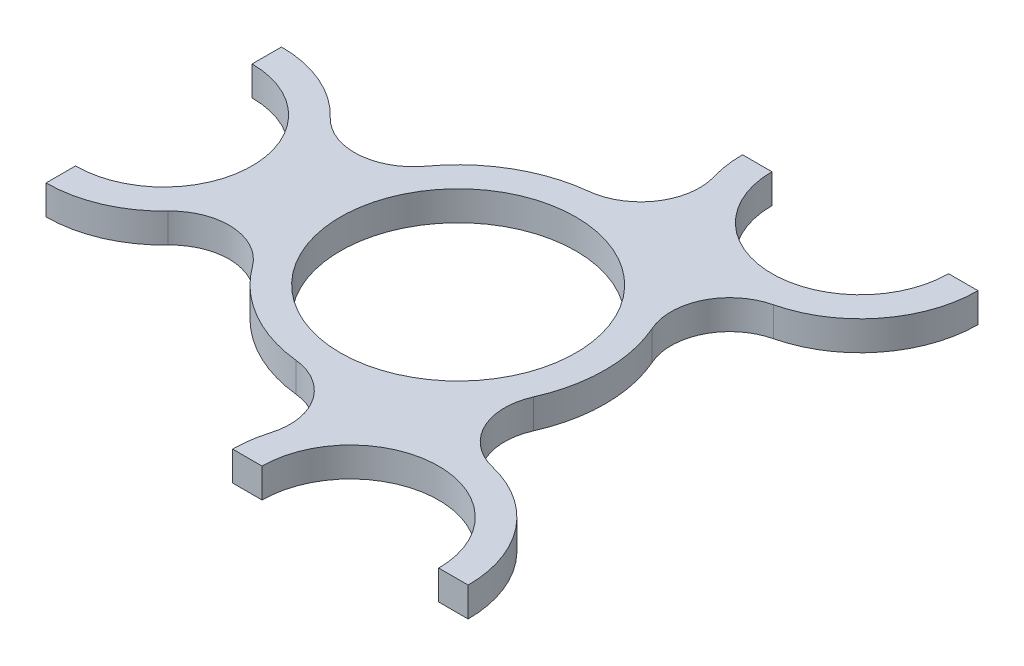
ISO-10303-21;
HEADER;
FILE_DESCRIPTION(('STEP AP214'),'2;1');
FILE_NAME('part.step','',(''),(''),'','','');
FILE_SCHEMA(('AUTOMOTIVE_DESIGN { 1 0 10303 214 1 1 1 1 }'));
ENDSEC;
DATA;
#1=APPLICATION_CONTEXT('core data for automotive mechanical design processes');
#2=APPLICATION_PROTOCOL_DEFINITION('international standard','automotive_design',2000,#1);
#3=PRODUCT_CONTEXT('',#1,'mechanical');
#4=PRODUCT('Part','Part','',(#3));
#5=PRODUCT_RELATED_PRODUCT_CATEGORY('part','',(#4));
#6=PRODUCT_DEFINITION_FORMATION('','',#4);
#7=PRODUCT_DEFINITION_CONTEXT('part definition',#1,'design');
#8=PRODUCT_DEFINITION('design','',#6,#7);
#9=PRODUCT_DEFINITION_SHAPE('','',#8);
#10=(LENGTH_UNIT() NAMED_UNIT(*) SI_UNIT(.MILLI.,.METRE.));
#11=(NAMED_UNIT(*) PLANE_ANGLE_UNIT() SI_UNIT($,.RADIAN.));
#12=(NAMED_UNIT(*) SI_UNIT($,.STERADIAN.) SOLID_ANGLE_UNIT());
#13=UNCERTAINTY_MEASURE_WITH_UNIT(LENGTH_MEASURE(1.E-05),#10,'distance_accuracy_value','');
#14=(GEOMETRIC_REPRESENTATION_CONTEXT(3) GLOBAL_UNCERTAINTY_ASSIGNED_CONTEXT((#13)) GLOBAL_UNIT_ASSIGNED_CONTEXT((#10,
#11,#12)) REPRESENTATION_CONTEXT('',''));
#15=CARTESIAN_POINT('',(0.,0.,0.));
#16=DIRECTION('',(0.,0.,1.));
#17=DIRECTION('',(1.,0.,0.));
#18=AXIS2_PLACEMENT_3D('',#15,#16,#17);
#19=CARTESIAN_POINT('',(-100.,10.,0.));
#20=DIRECTION('',(0.,1.,0.));
#21=DIRECTION('',(0.,0.,1.));
#22=AXIS2_PLACEMENT_3D('',#19,#20,#21);
#23=PLANE('',#22);
#24=CARTESIAN_POINT('',(-100.,10.,0.));
#25=DIRECTION('',(0.,1.,0.));
#26=DIRECTION('',(0.,0.,1.));
#27=AXIS2_PLACEMENT_3D('',#24,#25,#26);
#28=CIRCLE('',#27,40.);
#29=CARTESIAN_POINT('',(-99.9999999999996,10.,40.));
#30=VERTEX_POINT('',#29);
#31=CARTESIAN_POINT('',(-71.,10.,27.5499546279118));
#32=VERTEX_POINT('',#31);
#33=EDGE_CURVE('E273',#30,#32,#28,.T.);
#34=ORIENTED_EDGE('',*,*,#33,.T.);
#35=CARTESIAN_POINT('',(-56.5,10.,41.3249319418677));
#36=DIRECTION('',(0.,-1.,0.));
#37=DIRECTION('',(0.,0.,1.));
#38=AXIS2_PLACEMENT_3D('',#35,#36,#37);
#39=CIRCLE('',#38,20.);
#40=CARTESIAN_POINT('',(-40.3571428571429,10.,29.5178085299055));
#41=VERTEX_POINT('',#40);
#42=EDGE_CURVE('E141',#32,#41,#39,.T.);
#43=ORIENTED_EDGE('',*,*,#42,.T.);
#44=CARTESIAN_POINT('',(0.,10.,0.));
#45=DIRECTION('',(0.,1.,0.));
#46=DIRECTION('',(0.,0.,1.));
#47=AXIS2_PLACEMENT_3D('',#44,#45,#46);
#48=CIRCLE('',#47,50.);
#49=CARTESIAN_POINT('',(-5.38512036041635,10.,49.7091589015931));
#50=VERTEX_POINT('',#49);
#51=EDGE_CURVE('E336',#41,#50,#48,.T.);
#52=ORIENTED_EDGE('',*,*,#51,.T.);
#53=CARTESIAN_POINT('',(-7.53916850458289,10.,69.5928224622303));
#54=DIRECTION('',(0.,-1.,0.));
#55=DIRECTION('',(0.,0.,1.));
#56=AXIS2_PLACEMENT_3D('',#53,#54,#55);
#57=CIRCLE('',#56,20.);
#58=CARTESIAN_POINT('',(11.6405543302781,10.,75.2618816414869));
#59=VERTEX_POINT('',#58);
#60=EDGE_CURVE('E355',#50,#59,#57,.T.);
#61=ORIENTED_EDGE('',*,*,#60,.T.);
#62=CARTESIAN_POINT('',(50.,10.,86.6));
#63=DIRECTION('',(0.,1.,0.));
#64=DIRECTION('',(0.,0.,-1.));
#65=AXIS2_PLACEMENT_3D('',#62,#63,#64);
#66=CIRCLE('',#65,40.);
#67=CARTESIAN_POINT('',(9.99999999999999,10.,86.5999999999997));
#68=VERTEX_POINT('',#67);
#69=EDGE_CURVE('E352',#59,#68,#66,.T.);
#70=ORIENTED_EDGE('',*,*,#69,.T.);
#71=DIRECTION('',(1.,0.,0.));
#72=VECTOR('',#71,1.);
#73=CARTESIAN_POINT('',(9.99999999999999,10.,86.5999999999997));
#74=LINE('',#73,#72);
#75=CARTESIAN_POINT('',(20.,10.,86.5999999999998));
#76=VERTEX_POINT('',#75);
#77=EDGE_CURVE('E354',#68,#76,#74,.T.);
#78=ORIENTED_EDGE('',*,*,#77,.T.);
#79=CARTESIAN_POINT('',(50.,10.,86.6));
#80=DIRECTION('',(0.,-1.,0.));
#81=DIRECTION('',(0.,0.,-1.));
#82=AXIS2_PLACEMENT_3D('',#79,#80,#81);
#83=CIRCLE('',#82,30.);
#84=CARTESIAN_POINT('',(80.,10.,86.5999999999999));
#85=VERTEX_POINT('',#84);
#86=EDGE_CURVE('E357',#76,#85,#83,.T.);
#87=ORIENTED_EDGE('',*,*,#86,.T.);
#88=DIRECTION('',(1.,0.,0.));
#89=VECTOR('',#88,1.);
#90=CARTESIAN_POINT('',(80.,10.,86.5999999999999));
#91=LINE('',#90,#89);
#92=CARTESIAN_POINT('',(90.,10.,86.6));
#93=VERTEX_POINT('',#92);
#94=EDGE_CURVE('E363',#85,#93,#91,.T.);
#95=ORIENTED_EDGE('',*,*,#94,.T.);
#96=CARTESIAN_POINT('',(50.,10.,86.6));
#97=DIRECTION('',(0.,1.,0.));
#98=DIRECTION('',(0.,0.,-1.));
#99=AXIS2_PLACEMENT_3D('',#96,#97,#98);
#100=CIRCLE('',#99,40.);
#101=CARTESIAN_POINT('',(59.3596363447783,10.,47.7104486077107));
#102=VERTEX_POINT('',#101);
#103=EDGE_CURVE('E365',#93,#102,#100,.T.);
#104=ORIENTED_EDGE('',*,*,#103,.T.);
#105=CARTESIAN_POINT('',(64.0394545171674,10.,28.2656729115661));
#106=DIRECTION('',(0.,-1.,0.));
#107=DIRECTION('',(0.,0.,1.));
#108=AXIS2_PLACEMENT_3D('',#105,#106,#107);
#109=CIRCLE('',#108,20.);
#110=CARTESIAN_POINT('',(45.7424675122625,10.,20.1897663654044));
#111=VERTEX_POINT('',#110);
#112=EDGE_CURVE('E367',#102,#111,#109,.T.);
#113=ORIENTED_EDGE('',*,*,#112,.T.);
#114=CARTESIAN_POINT('',(0.,10.,0.));
#115=DIRECTION('',(0.,1.,0.));
#116=DIRECTION('',(0.,0.,1.));
#117=AXIS2_PLACEMENT_3D('',#114,#115,#116);
#118=CIRCLE('',#117,50.);
#119=CARTESIAN_POINT('',(45.7424675122625,10.,-20.1897663654044));
#120=VERTEX_POINT('',#119);
#121=EDGE_CURVE('E369',#111,#120,#118,.T.);
#122=ORIENTED_EDGE('',*,*,#121,.T.);
#123=CARTESIAN_POINT('',(64.0394545171674,10.,-28.2656729115661));
#124=DIRECTION('',(0.,-1.,0.));
#125=DIRECTION('',(0.,0.,1.));
#126=AXIS2_PLACEMENT_3D('',#123,#124,#125);
#127=CIRCLE('',#126,20.);
#128=CARTESIAN_POINT('',(59.3596363447783,10.,-47.7104486077107));
#129=VERTEX_POINT('',#128);
#130=EDGE_CURVE('E371',#120,#129,#127,.T.);
#131=ORIENTED_EDGE('',*,*,#130,.T.);
#132=CARTESIAN_POINT('',(50.,10.,-86.6));
#133=DIRECTION('',(0.,1.,0.));
#134=DIRECTION('',(0.,0.,1.));
#135=AXIS2_PLACEMENT_3D('',#132,#133,#134);
#136=CIRCLE('',#135,40.);
#137=CARTESIAN_POINT('',(90.,10.,-86.6));
#138=VERTEX_POINT('',#137);
#139=EDGE_CURVE('E373',#129,#138,#136,.T.);
#140=ORIENTED_EDGE('',*,*,#139,.T.);
#141=DIRECTION('',(-1.,0.,0.));
#142=VECTOR('',#141,1.);
#143=CARTESIAN_POINT('',(80.,10.,-86.5999999999999));
#144=LINE('',#143,#142);
#145=CARTESIAN_POINT('',(80.,10.,-86.5999999999999));
#146=VERTEX_POINT('',#145);
#147=EDGE_CURVE('E375',#138,#146,#144,.T.);
#148=ORIENTED_EDGE('',*,*,#147,.T.);
#149=CARTESIAN_POINT('',(50.,10.,-86.6));
#150=DIRECTION('',(0.,-1.,0.));
#151=DIRECTION('',(0.,0.,1.));
#152=AXIS2_PLACEMENT_3D('',#149,#150,#151);
#153=CIRCLE('',#152,30.);
#154=CARTESIAN_POINT('',(20.,10.,-86.5999999999998));
#155=VERTEX_POINT('',#154);
#156=EDGE_CURVE('E377',#146,#155,#153,.T.);
#157=ORIENTED_EDGE('',*,*,#156,.T.);
#158=DIRECTION('',(-1.,0.,0.));
#159=VECTOR('',#158,1.);
#160=CARTESIAN_POINT('',(9.99999999999998,10.,-86.5999999999997));
#161=LINE('',#160,#159);
#162=CARTESIAN_POINT('',(9.99999999999998,10.,-86.5999999999997));
#163=VERTEX_POINT('',#162);
#164=EDGE_CURVE('E379',#155,#163,#161,.T.);
#165=ORIENTED_EDGE('',*,*,#164,.T.);
#166=CARTESIAN_POINT('',(50.,10.,-86.6));
#167=DIRECTION('',(0.,1.,0.));
#168=DIRECTION('',(0.,0.,1.));
#169=AXIS2_PLACEMENT_3D('',#166,#167,#168);
#170=CIRCLE('',#169,40.);
#171=CARTESIAN_POINT('',(11.6405543302781,10.,-75.2618816414869));
#172=VERTEX_POINT('',#171);
#173=EDGE_CURVE('E381',#163,#172,#170,.T.);
#174=ORIENTED_EDGE('',*,*,#173,.T.);
#175=CARTESIAN_POINT('',(-7.53916850458291,10.,-69.5928224622303));
#176=DIRECTION('',(0.,-1.,0.));
#177=DIRECTION('',(0.,0.,1.));
#178=AXIS2_PLACEMENT_3D('',#175,#176,#177);
#179=CIRCLE('',#178,20.);
#180=CARTESIAN_POINT('',(-5.38512036041635,10.,-49.7091589015931));
#181=VERTEX_POINT('',#180);
#182=EDGE_CURVE('E383',#172,#181,#179,.T.);
#183=ORIENTED_EDGE('',*,*,#182,.T.);
#184=CARTESIAN_POINT('',(0.,10.,0.));
#185=DIRECTION('',(0.,1.,0.));
#186=DIRECTION('',(0.,0.,1.));
#187=AXIS2_PLACEMENT_3D('',#184,#185,#186);
#188=CIRCLE('',#187,50.);
#189=CARTESIAN_POINT('',(-40.3571428571429,10.,-29.5178085299055));
#190=VERTEX_POINT('',#189);
#191=EDGE_CURVE('E385',#181,#190,#188,.T.);
#192=ORIENTED_EDGE('',*,*,#191,.T.);
#193=CARTESIAN_POINT('',(-56.5,10.,-41.3249319418677));
#194=DIRECTION('',(0.,-1.,0.));
#195=DIRECTION('',(0.,0.,1.));
#196=AXIS2_PLACEMENT_3D('',#193,#194,#195);
#197=CIRCLE('',#196,20.);
#198=CARTESIAN_POINT('',(-71.,10.,-27.5499546279118));
#199=VERTEX_POINT('',#198);
#200=EDGE_CURVE('E387',#190,#199,#197,.T.);
#201=ORIENTED_EDGE('',*,*,#200,.T.);
#202=CARTESIAN_POINT('',(-100.,10.,0.));
#203=DIRECTION('',(0.,1.,0.));
#204=DIRECTION('',(0.,0.,1.));
#205=AXIS2_PLACEMENT_3D('',#202,#203,#204);
#206=CIRCLE('',#205,40.);
#207=CARTESIAN_POINT('',(-100.,10.,-40.));
#208=VERTEX_POINT('',#207);
#209=EDGE_CURVE('E208',#199,#208,#206,.T.);
#210=ORIENTED_EDGE('',*,*,#209,.T.);
#211=DIRECTION('',(0.,0.,1.));
#212=VECTOR('',#211,1.);
#213=CARTESIAN_POINT('',(-100.,10.,-30.));
#214=LINE('',#213,#212);
#215=CARTESIAN_POINT('',(-100.,10.,-30.));
#216=VERTEX_POINT('',#215);
#217=EDGE_CURVE('E202',#208,#216,#214,.T.);
#218=ORIENTED_EDGE('',*,*,#217,.T.);
#219=CARTESIAN_POINT('',(-100.,10.,0.));
#220=DIRECTION('',(0.,-1.,0.));
#221=DIRECTION('',(0.,0.,1.));
#222=AXIS2_PLACEMENT_3D('',#219,#220,#221);
#223=CIRCLE('',#222,30.);
#224=CARTESIAN_POINT('',(-99.9999999999997,10.,30.));
#225=VERTEX_POINT('',#224);
#226=EDGE_CURVE('E206',#216,#225,#223,.T.);
#227=ORIENTED_EDGE('',*,*,#226,.T.);
#228=DIRECTION('',(0.,0.,1.));
#229=VECTOR('',#228,1.);
#230=CARTESIAN_POINT('',(-99.9999999999996,10.,40.));
#231=LINE('',#230,#229);
#232=EDGE_CURVE('E50',#225,#30,#231,.T.);
#233=ORIENTED_EDGE('',*,*,#232,.T.);
#234=EDGE_LOOP('',(#34,#43,#52,#61,#70,#78,#87,#95,#104,#113,#122,#131,#140,#148,#157,#165,#174,
#183,#192,#201,#210,#218,#227,#233));
#235=FACE_BOUND('',#234,.T.);
#236=CARTESIAN_POINT('',(0.,10.,0.));
#237=DIRECTION('',(0.,1.,0.));
#238=DIRECTION('',(0.,0.,1.));
#239=AXIS2_PLACEMENT_3D('',#236,#237,#238);
#240=CIRCLE('',#239,40.);
#241=CARTESIAN_POINT('',(0.,10.,40.));
#242=VERTEX_POINT('',#241);
#243=EDGE_CURVE('E230',#242,#242,#240,.T.);
#244=ORIENTED_EDGE('',*,*,#243,.F.);
#245=EDGE_LOOP('',(#244));
#246=FACE_BOUND('',#245,.T.);
#247=ADVANCED_FACE('F33',(#235,#246),#23,.T.);
#248=CARTESIAN_POINT('',(-100.,0.,0.));
#249=DIRECTION('',(0.,1.,0.));
#250=DIRECTION('',(0.,0.,1.));
#251=AXIS2_PLACEMENT_3D('',#248,#249,#250);
#252=PLANE('',#251);
#253=CARTESIAN_POINT('',(-100.,0.,0.));
#254=DIRECTION('',(0.,1.,0.));
#255=DIRECTION('',(0.,0.,1.));
#256=AXIS2_PLACEMENT_3D('',#253,#254,#255);
#257=CIRCLE('',#256,40.);
#258=CARTESIAN_POINT('',(-99.9999999999996,0.,40.));
#259=VERTEX_POINT('',#258);
#260=CARTESIAN_POINT('',(-71.,0.,27.5499546279118));
#261=VERTEX_POINT('',#260);
#262=EDGE_CURVE('E226',#259,#261,#257,.T.);
#263=ORIENTED_EDGE('',*,*,#262,.F.);
#264=DIRECTION('',(0.,0.,1.));
#265=VECTOR('',#264,1.);
#266=CARTESIAN_POINT('',(-99.9999999999996,0.,40.));
#267=LINE('',#266,#265);
#268=CARTESIAN_POINT('',(-99.9999999999997,0.,30.));
#269=VERTEX_POINT('',#268);
#270=EDGE_CURVE('E133',#269,#259,#267,.T.);
#271=ORIENTED_EDGE('',*,*,#270,.F.);
#272=CARTESIAN_POINT('',(-100.,0.,0.));
#273=DIRECTION('',(0.,-1.,0.));
#274=DIRECTION('',(0.,0.,1.));
#275=AXIS2_PLACEMENT_3D('',#272,#273,#274);
#276=CIRCLE('',#275,30.);
#277=CARTESIAN_POINT('',(-100.,0.,-30.));
#278=VERTEX_POINT('',#277);
#279=EDGE_CURVE('E127',#278,#269,#276,.T.);
#280=ORIENTED_EDGE('',*,*,#279,.F.);
#281=DIRECTION('',(0.,0.,1.));
#282=VECTOR('',#281,1.);
#283=CARTESIAN_POINT('',(-100.,0.,-30.));
#284=LINE('',#283,#282);
#285=CARTESIAN_POINT('',(-100.,0.,-40.));
#286=VERTEX_POINT('',#285);
#287=EDGE_CURVE('E216',#286,#278,#284,.T.);
#288=ORIENTED_EDGE('',*,*,#287,.F.);
#289=CARTESIAN_POINT('',(-100.,0.,0.));
#290=DIRECTION('',(0.,1.,0.));
#291=DIRECTION('',(0.,0.,1.));
#292=AXIS2_PLACEMENT_3D('',#289,#290,#291);
#293=CIRCLE('',#292,40.);
#294=CARTESIAN_POINT('',(-71.,0.,-27.5499546279118));
#295=VERTEX_POINT('',#294);
#296=EDGE_CURVE('E268',#295,#286,#293,.T.);
#297=ORIENTED_EDGE('',*,*,#296,.F.);
#298=CARTESIAN_POINT('',(-56.5,0.,-41.3249319418677));
#299=DIRECTION('',(0.,-1.,0.));
#300=DIRECTION('',(0.,0.,1.));
#301=AXIS2_PLACEMENT_3D('',#298,#299,#300);
#302=CIRCLE('',#301,20.);
#303=CARTESIAN_POINT('',(-40.3571428571429,0.,-29.5178085299055));
#304=VERTEX_POINT('',#303);
#305=EDGE_CURVE('E266',#304,#295,#302,.T.);
#306=ORIENTED_EDGE('',*,*,#305,.F.);
#307=CARTESIAN_POINT('',(0.,0.,0.));
#308=DIRECTION('',(0.,1.,0.));
#309=DIRECTION('',(0.,0.,1.));
#310=AXIS2_PLACEMENT_3D('',#307,#308,#309);
#311=CIRCLE('',#310,50.);
#312=CARTESIAN_POINT('',(-5.38512036041635,0.,-49.7091589015931));
#313=VERTEX_POINT('',#312);
#314=EDGE_CURVE('E264',#313,#304,#311,.T.);
#315=ORIENTED_EDGE('',*,*,#314,.F.);
#316=CARTESIAN_POINT('',(-7.53916850458291,0.,-69.5928224622303));
#317=DIRECTION('',(0.,-1.,0.));
#318=DIRECTION('',(0.,0.,1.));
#319=AXIS2_PLACEMENT_3D('',#316,#317,#318);
#320=CIRCLE('',#319,20.);
#321=CARTESIAN_POINT('',(11.6405543302781,0.,-75.2618816414869));
#322=VERTEX_POINT('',#321);
#323=EDGE_CURVE('E262',#322,#313,#320,.T.);
#324=ORIENTED_EDGE('',*,*,#323,.F.);
#325=CARTESIAN_POINT('',(50.,0.,-86.6));
#326=DIRECTION('',(0.,1.,0.));
#327=DIRECTION('',(0.,0.,1.));
#328=AXIS2_PLACEMENT_3D('',#325,#326,#327);
#329=CIRCLE('',#328,40.);
#330=CARTESIAN_POINT('',(9.99999999999998,0.,-86.5999999999997));
#331=VERTEX_POINT('',#330);
#332=EDGE_CURVE('E260',#331,#322,#329,.T.);
#333=ORIENTED_EDGE('',*,*,#332,.F.);
#334=DIRECTION('',(-1.,0.,0.));
#335=VECTOR('',#334,1.);
#336=CARTESIAN_POINT('',(9.99999999999998,0.,-86.5999999999997));
#337=LINE('',#336,#335);
#338=CARTESIAN_POINT('',(20.,0.,-86.5999999999998));
#339=VERTEX_POINT('',#338);
#340=EDGE_CURVE('E258',#339,#331,#337,.T.);
#341=ORIENTED_EDGE('',*,*,#340,.F.);
#342=CARTESIAN_POINT('',(50.,0.,-86.6));
#343=DIRECTION('',(0.,-1.,0.));
#344=DIRECTION('',(0.,0.,1.));
#345=AXIS2_PLACEMENT_3D('',#342,#343,#344);
#346=CIRCLE('',#345,30.);
#347=CARTESIAN_POINT('',(80.,0.,-86.5999999999999));
#348=VERTEX_POINT('',#347);
#349=EDGE_CURVE('E256',#348,#339,#346,.T.);
#350=ORIENTED_EDGE('',*,*,#349,.F.);
#351=DIRECTION('',(-1.,0.,0.));
#352=VECTOR('',#351,1.);
#353=CARTESIAN_POINT('',(80.,0.,-86.5999999999999));
#354=LINE('',#353,#352);
#355=CARTESIAN_POINT('',(90.,0.,-86.6));
#356=VERTEX_POINT('',#355);
#357=EDGE_CURVE('E254',#356,#348,#354,.T.);
#358=ORIENTED_EDGE('',*,*,#357,.F.);
#359=CARTESIAN_POINT('',(50.,0.,-86.6));
#360=DIRECTION('',(0.,1.,0.));
#361=DIRECTION('',(0.,0.,1.));
#362=AXIS2_PLACEMENT_3D('',#359,#360,#361);
#363=CIRCLE('',#362,40.);
#364=CARTESIAN_POINT('',(59.3596363447783,0.,-47.7104486077107));
#365=VERTEX_POINT('',#364);
#366=EDGE_CURVE('E252',#365,#356,#363,.T.);
#367=ORIENTED_EDGE('',*,*,#366,.F.);
#368=CARTESIAN_POINT('',(64.0394545171674,0.,-28.2656729115661));
#369=DIRECTION('',(0.,-1.,0.));
#370=DIRECTION('',(0.,0.,1.));
#371=AXIS2_PLACEMENT_3D('',#368,#369,#370);
#372=CIRCLE('',#371,20.);
#373=CARTESIAN_POINT('',(45.7424675122625,0.,-20.1897663654044));
#374=VERTEX_POINT('',#373);
#375=EDGE_CURVE('E250',#374,#365,#372,.T.);
#376=ORIENTED_EDGE('',*,*,#375,.F.);
#377=CARTESIAN_POINT('',(0.,0.,0.));
#378=DIRECTION('',(0.,1.,0.));
#379=DIRECTION('',(0.,0.,1.));
#380=AXIS2_PLACEMENT_3D('',#377,#378,#379);
#381=CIRCLE('',#380,50.);
#382=CARTESIAN_POINT('',(45.7424675122625,0.,20.1897663654044));
#383=VERTEX_POINT('',#382);
#384=EDGE_CURVE('E248',#383,#374,#381,.T.);
#385=ORIENTED_EDGE('',*,*,#384,.F.);
#386=CARTESIAN_POINT('',(64.0394545171674,0.,28.2656729115661));
#387=DIRECTION('',(0.,-1.,0.));
#388=DIRECTION('',(0.,0.,1.));
#389=AXIS2_PLACEMENT_3D('',#386,#387,#388);
#390=CIRCLE('',#389,20.);
#391=CARTESIAN_POINT('',(59.3596363447783,0.,47.7104486077107));
#392=VERTEX_POINT('',#391);
#393=EDGE_CURVE('E246',#392,#383,#390,.T.);
#394=ORIENTED_EDGE('',*,*,#393,.F.);
#395=CARTESIAN_POINT('',(50.,0.,86.6));
#396=DIRECTION('',(0.,1.,0.));
#397=DIRECTION('',(0.,0.,-1.));
#398=AXIS2_PLACEMENT_3D('',#395,#396,#397);
#399=CIRCLE('',#398,40.);
#400=CARTESIAN_POINT('',(90.,0.,86.6));
#401=VERTEX_POINT('',#400);
#402=EDGE_CURVE('E244',#401,#392,#399,.T.);
#403=ORIENTED_EDGE('',*,*,#402,.F.);
#404=DIRECTION('',(1.,0.,0.));
#405=VECTOR('',#404,1.);
#406=CARTESIAN_POINT('',(80.,0.,86.5999999999999));
#407=LINE('',#406,#405);
#408=CARTESIAN_POINT('',(80.,0.,86.5999999999999));
#409=VERTEX_POINT('',#408);
#410=EDGE_CURVE('E242',#409,#401,#407,.T.);
#411=ORIENTED_EDGE('',*,*,#410,.F.);
#412=CARTESIAN_POINT('',(50.,0.,86.6));
#413=DIRECTION('',(0.,-1.,0.));
#414=DIRECTION('',(0.,0.,-1.));
#415=AXIS2_PLACEMENT_3D('',#412,#413,#414);
#416=CIRCLE('',#415,30.);
#417=CARTESIAN_POINT('',(20.,0.,86.5999999999998));
#418=VERTEX_POINT('',#417);
#419=EDGE_CURVE('E240',#418,#409,#416,.T.);
#420=ORIENTED_EDGE('',*,*,#419,.F.);
#421=DIRECTION('',(1.,0.,0.));
#422=VECTOR('',#421,1.);
#423=CARTESIAN_POINT('',(9.99999999999999,0.,86.5999999999997));
#424=LINE('',#423,#422);
#425=CARTESIAN_POINT('',(9.99999999999999,0.,86.5999999999997));
#426=VERTEX_POINT('',#425);
#427=EDGE_CURVE('E238',#426,#418,#424,.T.);
#428=ORIENTED_EDGE('',*,*,#427,.F.);
#429=CARTESIAN_POINT('',(50.,0.,86.6));
#430=DIRECTION('',(0.,1.,0.));
#431=DIRECTION('',(0.,0.,-1.));
#432=AXIS2_PLACEMENT_3D('',#429,#430,#431);
#433=CIRCLE('',#432,40.);
#434=CARTESIAN_POINT('',(11.6405543302781,0.,75.2618816414869));
#435=VERTEX_POINT('',#434);
#436=EDGE_CURVE('E236',#435,#426,#433,.T.);
#437=ORIENTED_EDGE('',*,*,#436,.F.);
#438=CARTESIAN_POINT('',(-7.53916850458289,0.,69.5928224622303));
#439=DIRECTION('',(0.,-1.,0.));
#440=DIRECTION('',(0.,0.,1.));
#441=AXIS2_PLACEMENT_3D('',#438,#439,#440);
#442=CIRCLE('',#441,20.);
#443=CARTESIAN_POINT('',(-5.38512036041635,0.,49.7091589015931));
#444=VERTEX_POINT('',#443);
#445=EDGE_CURVE('E234',#444,#435,#442,.T.);
#446=ORIENTED_EDGE('',*,*,#445,.F.);
#447=CARTESIAN_POINT('',(0.,0.,0.));
#448=DIRECTION('',(0.,1.,0.));
#449=DIRECTION('',(0.,0.,1.));
#450=AXIS2_PLACEMENT_3D('',#447,#448,#449);
#451=CIRCLE('',#450,50.);
#452=CARTESIAN_POINT('',(-40.3571428571429,0.,29.5178085299055));
#453=VERTEX_POINT('',#452);
#454=EDGE_CURVE('E232',#453,#444,#451,.T.);
#455=ORIENTED_EDGE('',*,*,#454,.F.);
#456=CARTESIAN_POINT('',(-56.5,0.,41.3249319418677));
#457=DIRECTION('',(0.,-1.,0.));
#458=DIRECTION('',(0.,0.,1.));
#459=AXIS2_PLACEMENT_3D('',#456,#457,#458);
#460=CIRCLE('',#459,20.);
#461=EDGE_CURVE('E229',#261,#453,#460,.T.);
#462=ORIENTED_EDGE('',*,*,#461,.F.);
#463=EDGE_LOOP('',(#263,#271,#280,#288,#297,#306,#315,#324,#333,#341,#350,#358,#367,#376,#385,
#394,#403,#411,#420,#428,#437,#446,#455,#462));
#464=FACE_BOUND('',#463,.T.);
#465=CARTESIAN_POINT('',(0.,0.,0.));
#466=DIRECTION('',(0.,1.,0.));
#467=DIRECTION('',(0.,0.,1.));
#468=AXIS2_PLACEMENT_3D('',#465,#466,#467);
#469=CIRCLE('',#468,40.);
#470=CARTESIAN_POINT('',(0.,0.,40.));
#471=VERTEX_POINT('',#470);
#472=EDGE_CURVE('E690',#471,#471,#469,.T.);
#473=ORIENTED_EDGE('',*,*,#472,.T.);
#474=EDGE_LOOP('',(#473));
#475=FACE_BOUND('',#474,.T.);
#476=ADVANCED_FACE('F340',(#464,#475),#252,.F.);
#477=CARTESIAN_POINT('',(-100.,10.,0.));
#478=DIRECTION('',(0.,-1.,0.));
#479=DIRECTION('',(0.,0.,-1.));
#480=AXIS2_PLACEMENT_3D('',#477,#478,#479);
#481=CYLINDRICAL_SURFACE('',#480,40.);
#482=ORIENTED_EDGE('',*,*,#262,.T.);
#483=DIRECTION('',(0.,-1.,0.));
#484=VECTOR('',#483,1.);
#485=CARTESIAN_POINT('',(-71.,10.,27.5499546279118));
#486=LINE('',#485,#484);
#487=EDGE_CURVE('E11',#32,#261,#486,.T.);
#488=ORIENTED_EDGE('',*,*,#487,.F.);
#489=ORIENTED_EDGE('',*,*,#33,.F.);
#490=DIRECTION('',(0.,-1.,0.));
#491=VECTOR('',#490,1.);
#492=CARTESIAN_POINT('',(-99.9999999999996,10.,40.));
#493=LINE('',#492,#491);
#494=EDGE_CURVE('E222',#30,#259,#493,.T.);
#495=ORIENTED_EDGE('',*,*,#494,.T.);
#496=EDGE_LOOP('',(#482,#488,#489,#495));
#497=FACE_BOUND('',#496,.T.);
#498=ADVANCED_FACE('F35',(#497),#481,.T.);
#499=CARTESIAN_POINT('',(-56.5,10.,41.3249319418677));
#500=DIRECTION('',(0.,-1.,0.));
#501=DIRECTION('',(0.,0.,-1.));
#502=AXIS2_PLACEMENT_3D('',#499,#500,#501);
#503=CYLINDRICAL_SURFACE('',#502,20.);
#504=ORIENTED_EDGE('',*,*,#461,.T.);
#505=DIRECTION('',(0.,-1.,0.));
#506=VECTOR('',#505,1.);
#507=CARTESIAN_POINT('',(-40.3571428571429,10.,29.5178085299055));
#508=LINE('',#507,#506);
#509=EDGE_CURVE('E42',#41,#453,#508,.T.);
#510=ORIENTED_EDGE('',*,*,#509,.F.);
#511=ORIENTED_EDGE('',*,*,#42,.F.);
#512=ORIENTED_EDGE('',*,*,#487,.T.);
#513=EDGE_LOOP('',(#504,#510,#511,#512));
#514=FACE_BOUND('',#513,.T.);
#515=ADVANCED_FACE('F421',(#514),#503,.F.);
#516=CARTESIAN_POINT('',(0.,10.,0.));
#517=DIRECTION('',(0.,-1.,0.));
#518=DIRECTION('',(0.,0.,-1.));
#519=AXIS2_PLACEMENT_3D('',#516,#517,#518);
#520=CYLINDRICAL_SURFACE('',#519,50.);
#521=ORIENTED_EDGE('',*,*,#454,.T.);
#522=DIRECTION('',(0.,-1.,0.));
#523=VECTOR('',#522,1.);
#524=CARTESIAN_POINT('',(-5.38512036041635,10.,49.7091589015931));
#525=LINE('',#524,#523);
#526=EDGE_CURVE('E328',#50,#444,#525,.T.);
#527=ORIENTED_EDGE('',*,*,#526,.F.);
#528=ORIENTED_EDGE('',*,*,#51,.F.);
#529=ORIENTED_EDGE('',*,*,#509,.T.);
#530=EDGE_LOOP('',(#521,#527,#528,#529));
#531=FACE_BOUND('',#530,.T.);
#532=ADVANCED_FACE('F334',(#531),#520,.T.);
#533=CARTESIAN_POINT('',(-7.53916850458289,10.,69.5928224622303));
#534=DIRECTION('',(0.,-1.,0.));
#535=DIRECTION('',(0.,0.,-1.));
#536=AXIS2_PLACEMENT_3D('',#533,#534,#535);
#537=CYLINDRICAL_SURFACE('',#536,20.);
#538=ORIENTED_EDGE('',*,*,#445,.T.);
#539=DIRECTION('',(0.,-1.,0.));
#540=VECTOR('',#539,1.);
#541=CARTESIAN_POINT('',(11.6405543302781,10.,75.2618816414869));
#542=LINE('',#541,#540);
#543=EDGE_CURVE('E325',#59,#435,#542,.T.);
#544=ORIENTED_EDGE('',*,*,#543,.F.);
#545=ORIENTED_EDGE('',*,*,#60,.F.);
#546=ORIENTED_EDGE('',*,*,#526,.T.);
#547=EDGE_LOOP('',(#538,#544,#545,#546));
#548=FACE_BOUND('',#547,.T.);
#549=ADVANCED_FACE('F346',(#548),#537,.F.);
#550=CARTESIAN_POINT('',(50.,10.,86.6));
#551=DIRECTION('',(0.,-1.,0.));
#552=DIRECTION('',(0.,0.,-1.));
#553=AXIS2_PLACEMENT_3D('',#550,#551,#552);
#554=CYLINDRICAL_SURFACE('',#553,40.);
#555=ORIENTED_EDGE('',*,*,#436,.T.);
#556=DIRECTION('',(0.,-1.,0.));
#557=VECTOR('',#556,1.);
#558=CARTESIAN_POINT('',(9.99999999999999,10.,86.5999999999997));
#559=LINE('',#558,#557);
#560=EDGE_CURVE('E322',#68,#426,#559,.T.);
#561=ORIENTED_EDGE('',*,*,#560,.F.);
#562=ORIENTED_EDGE('',*,*,#69,.F.);
#563=ORIENTED_EDGE('',*,*,#543,.T.);
#564=EDGE_LOOP('',(#555,#561,#562,#563));
#565=FACE_BOUND('',#564,.T.);
#566=ADVANCED_FACE('F350',(#565),#554,.T.);
#567=CARTESIAN_POINT('',(9.99999999999999,10.,86.5999999999997));
#568=DIRECTION('',(0.,0.,-1.));
#569=DIRECTION('',(-1.,0.,0.));
#570=AXIS2_PLACEMENT_3D('',#567,#568,#569);
#571=PLANE('',#570);
#572=ORIENTED_EDGE('',*,*,#427,.T.);
#573=DIRECTION('',(0.,-1.,0.));
#574=VECTOR('',#573,1.);
#575=CARTESIAN_POINT('',(20.,10.,86.5999999999998));
#576=LINE('',#575,#574);
#577=EDGE_CURVE('E319',#76,#418,#576,.T.);
#578=ORIENTED_EDGE('',*,*,#577,.F.);
#579=ORIENTED_EDGE('',*,*,#77,.F.);
#580=ORIENTED_EDGE('',*,*,#560,.T.);
#581=EDGE_LOOP('',(#572,#578,#579,#580));
#582=FACE_BOUND('',#581,.T.);
#583=ADVANCED_FACE('F434',(#582),#571,.F.);
#584=CARTESIAN_POINT('',(50.,10.,86.6));
#585=DIRECTION('',(0.,-1.,0.));
#586=DIRECTION('',(0.,0.,-1.));
#587=AXIS2_PLACEMENT_3D('',#584,#585,#586);
#588=CYLINDRICAL_SURFACE('',#587,30.);
#589=ORIENTED_EDGE('',*,*,#419,.T.);
#590=DIRECTION('',(0.,-1.,0.));
#591=VECTOR('',#590,1.);
#592=CARTESIAN_POINT('',(80.,10.,86.5999999999999));
#593=LINE('',#592,#591);
#594=EDGE_CURVE('E316',#85,#409,#593,.T.);
#595=ORIENTED_EDGE('',*,*,#594,.F.);
#596=ORIENTED_EDGE('',*,*,#86,.F.);
#597=ORIENTED_EDGE('',*,*,#577,.T.);
#598=EDGE_LOOP('',(#589,#595,#596,#597));
#599=FACE_BOUND('',#598,.T.);
#600=ADVANCED_FACE('F437',(#599),#588,.F.);
#601=CARTESIAN_POINT('',(80.,10.,86.5999999999999));
#602=DIRECTION('',(0.,0.,-1.));
#603=DIRECTION('',(-1.,0.,0.));
#604=AXIS2_PLACEMENT_3D('',#601,#602,#603);
#605=PLANE('',#604);
#606=ORIENTED_EDGE('',*,*,#410,.T.);
#607=DIRECTION('',(0.,-1.,0.));
#608=VECTOR('',#607,1.);
#609=CARTESIAN_POINT('',(90.,10.,86.6));
#610=LINE('',#609,#608);
#611=EDGE_CURVE('E313',#93,#401,#610,.T.);
#612=ORIENTED_EDGE('',*,*,#611,.F.);
#613=ORIENTED_EDGE('',*,*,#94,.F.);
#614=ORIENTED_EDGE('',*,*,#594,.T.);
#615=EDGE_LOOP('',(#606,#612,#613,#614));
#616=FACE_BOUND('',#615,.T.);
#617=ADVANCED_FACE('F441',(#616),#605,.F.);
#618=CARTESIAN_POINT('',(50.,10.,86.6));
#619=DIRECTION('',(0.,-1.,0.));
#620=DIRECTION('',(0.,0.,-1.));
#621=AXIS2_PLACEMENT_3D('',#618,#619,#620);
#622=CYLINDRICAL_SURFACE('',#621,40.);
#623=ORIENTED_EDGE('',*,*,#402,.T.);
#624=DIRECTION('',(0.,-1.,0.));
#625=VECTOR('',#624,1.);
#626=CARTESIAN_POINT('',(59.3596363447783,10.,47.7104486077107));
#627=LINE('',#626,#625);
#628=EDGE_CURVE('E310',#102,#392,#627,.T.);
#629=ORIENTED_EDGE('',*,*,#628,.F.);
#630=ORIENTED_EDGE('',*,*,#103,.F.);
#631=ORIENTED_EDGE('',*,*,#611,.T.);
#632=EDGE_LOOP('',(#623,#629,#630,#631));
#633=FACE_BOUND('',#632,.T.);
#634=ADVANCED_FACE('F445',(#633),#622,.T.);
#635=CARTESIAN_POINT('',(64.0394545171674,10.,28.2656729115661));
#636=DIRECTION('',(0.,-1.,0.));
#637=DIRECTION('',(0.,0.,-1.));
#638=AXIS2_PLACEMENT_3D('',#635,#636,#637);
#639=CYLINDRICAL_SURFACE('',#638,20.);
#640=ORIENTED_EDGE('',*,*,#393,.T.);
#641=DIRECTION('',(0.,-1.,0.));
#642=VECTOR('',#641,1.);
#643=CARTESIAN_POINT('',(45.7424675122625,10.,20.1897663654044));
#644=LINE('',#643,#642);
#645=EDGE_CURVE('E307',#111,#383,#644,.T.);
#646=ORIENTED_EDGE('',*,*,#645,.F.);
#647=ORIENTED_EDGE('',*,*,#112,.F.);
#648=ORIENTED_EDGE('',*,*,#628,.T.);
#649=EDGE_LOOP('',(#640,#646,#647,#648));
#650=FACE_BOUND('',#649,.T.);
#651=ADVANCED_FACE('F449',(#650),#639,.F.);
#652=CARTESIAN_POINT('',(0.,10.,0.));
#653=DIRECTION('',(0.,-1.,0.));
#654=DIRECTION('',(0.,0.,-1.));
#655=AXIS2_PLACEMENT_3D('',#652,#653,#654);
#656=CYLINDRICAL_SURFACE('',#655,50.);
#657=ORIENTED_EDGE('',*,*,#384,.T.);
#658=DIRECTION('',(0.,-1.,0.));
#659=VECTOR('',#658,1.);
#660=CARTESIAN_POINT('',(45.7424675122625,10.,-20.1897663654044));
#661=LINE('',#660,#659);
#662=EDGE_CURVE('E304',#120,#374,#661,.T.);
#663=ORIENTED_EDGE('',*,*,#662,.F.);
#664=ORIENTED_EDGE('',*,*,#121,.F.);
#665=ORIENTED_EDGE('',*,*,#645,.T.);
#666=EDGE_LOOP('',(#657,#663,#664,#665));
#667=FACE_BOUND('',#666,.T.);
#668=ADVANCED_FACE('F453',(#667),#656,.T.);
#669=CARTESIAN_POINT('',(64.0394545171674,10.,-28.2656729115661));
#670=DIRECTION('',(0.,-1.,0.));
#671=DIRECTION('',(0.,0.,-1.));
#672=AXIS2_PLACEMENT_3D('',#669,#670,#671);
#673=CYLINDRICAL_SURFACE('',#672,20.);
#674=ORIENTED_EDGE('',*,*,#375,.T.);
#675=DIRECTION('',(0.,-1.,0.));
#676=VECTOR('',#675,1.);
#677=CARTESIAN_POINT('',(59.3596363447783,10.,-47.7104486077107));
#678=LINE('',#677,#676);
#679=EDGE_CURVE('E301',#129,#365,#678,.T.);
#680=ORIENTED_EDGE('',*,*,#679,.F.);
#681=ORIENTED_EDGE('',*,*,#130,.F.);
#682=ORIENTED_EDGE('',*,*,#662,.T.);
#683=EDGE_LOOP('',(#674,#680,#681,#682));
#684=FACE_BOUND('',#683,.T.);
#685=ADVANCED_FACE('F457',(#684),#673,.F.);
#686=CARTESIAN_POINT('',(50.,10.,-86.6));
#687=DIRECTION('',(0.,-1.,0.));
#688=DIRECTION('',(0.,0.,-1.));
#689=AXIS2_PLACEMENT_3D('',#686,#687,#688);
#690=CYLINDRICAL_SURFACE('',#689,40.);
#691=ORIENTED_EDGE('',*,*,#366,.T.);
#692=DIRECTION('',(0.,-1.,0.));
#693=VECTOR('',#692,1.);
#694=CARTESIAN_POINT('',(90.,10.,-86.6));
#695=LINE('',#694,#693);
#696=EDGE_CURVE('E298',#138,#356,#695,.T.);
#697=ORIENTED_EDGE('',*,*,#696,.F.);
#698=ORIENTED_EDGE('',*,*,#139,.F.);
#699=ORIENTED_EDGE('',*,*,#679,.T.);
#700=EDGE_LOOP('',(#691,#697,#698,#699));
#701=FACE_BOUND('',#700,.T.);
#702=ADVANCED_FACE('F461',(#701),#690,.T.);
#703=CARTESIAN_POINT('',(80.,10.,-86.5999999999999));
#704=DIRECTION('',(0.,0.,1.));
#705=DIRECTION('',(1.,0.,0.));
#706=AXIS2_PLACEMENT_3D('',#703,#704,#705);
#707=PLANE('',#706);
#708=ORIENTED_EDGE('',*,*,#357,.T.);
#709=DIRECTION('',(0.,-1.,0.));
#710=VECTOR('',#709,1.);
#711=CARTESIAN_POINT('',(80.,10.,-86.5999999999999));
#712=LINE('',#711,#710);
#713=EDGE_CURVE('E295',#146,#348,#712,.T.);
#714=ORIENTED_EDGE('',*,*,#713,.F.);
#715=ORIENTED_EDGE('',*,*,#147,.F.);
#716=ORIENTED_EDGE('',*,*,#696,.T.);
#717=EDGE_LOOP('',(#708,#714,#715,#716));
#718=FACE_BOUND('',#717,.T.);
#719=ADVANCED_FACE('F465',(#718),#707,.F.);
#720=CARTESIAN_POINT('',(50.,10.,-86.6));
#721=DIRECTION('',(0.,-1.,0.));
#722=DIRECTION('',(0.,0.,-1.));
#723=AXIS2_PLACEMENT_3D('',#720,#721,#722);
#724=CYLINDRICAL_SURFACE('',#723,30.);
#725=ORIENTED_EDGE('',*,*,#349,.T.);
#726=DIRECTION('',(0.,-1.,0.));
#727=VECTOR('',#726,1.);
#728=CARTESIAN_POINT('',(20.,10.,-86.5999999999998));
#729=LINE('',#728,#727);
#730=EDGE_CURVE('E292',#155,#339,#729,.T.);
#731=ORIENTED_EDGE('',*,*,#730,.F.);
#732=ORIENTED_EDGE('',*,*,#156,.F.);
#733=ORIENTED_EDGE('',*,*,#713,.T.);
#734=EDGE_LOOP('',(#725,#731,#732,#733));
#735=FACE_BOUND('',#734,.T.);
#736=ADVANCED_FACE('F469',(#735),#724,.F.);
#737=CARTESIAN_POINT('',(9.99999999999998,10.,-86.5999999999997));
#738=DIRECTION('',(0.,0.,1.));
#739=DIRECTION('',(1.,0.,0.));
#740=AXIS2_PLACEMENT_3D('',#737,#738,#739);
#741=PLANE('',#740);
#742=ORIENTED_EDGE('',*,*,#340,.T.);
#743=DIRECTION('',(0.,-1.,0.));
#744=VECTOR('',#743,1.);
#745=CARTESIAN_POINT('',(9.99999999999998,10.,-86.5999999999997));
#746=LINE('',#745,#744);
#747=EDGE_CURVE('E289',#163,#331,#746,.T.);
#748=ORIENTED_EDGE('',*,*,#747,.F.);
#749=ORIENTED_EDGE('',*,*,#164,.F.);
#750=ORIENTED_EDGE('',*,*,#730,.T.);
#751=EDGE_LOOP('',(#742,#748,#749,#750));
#752=FACE_BOUND('',#751,.T.);
#753=ADVANCED_FACE('F473',(#752),#741,.F.);
#754=CARTESIAN_POINT('',(50.,10.,-86.6));
#755=DIRECTION('',(0.,-1.,0.));
#756=DIRECTION('',(0.,0.,-1.));
#757=AXIS2_PLACEMENT_3D('',#754,#755,#756);
#758=CYLINDRICAL_SURFACE('',#757,40.);
#759=ORIENTED_EDGE('',*,*,#332,.T.);
#760=DIRECTION('',(0.,-1.,0.));
#761=VECTOR('',#760,1.);
#762=CARTESIAN_POINT('',(11.6405543302781,10.,-75.2618816414869));
#763=LINE('',#762,#761);
#764=EDGE_CURVE('E286',#172,#322,#763,.T.);
#765=ORIENTED_EDGE('',*,*,#764,.F.);
#766=ORIENTED_EDGE('',*,*,#173,.F.);
#767=ORIENTED_EDGE('',*,*,#747,.T.);
#768=EDGE_LOOP('',(#759,#765,#766,#767));
#769=FACE_BOUND('',#768,.T.);
#770=ADVANCED_FACE('F477',(#769),#758,.T.);
#771=CARTESIAN_POINT('',(-7.53916850458291,10.,-69.5928224622303));
#772=DIRECTION('',(0.,-1.,0.));
#773=DIRECTION('',(0.,0.,-1.));
#774=AXIS2_PLACEMENT_3D('',#771,#772,#773);
#775=CYLINDRICAL_SURFACE('',#774,20.);
#776=ORIENTED_EDGE('',*,*,#323,.T.);
#777=DIRECTION('',(0.,-1.,0.));
#778=VECTOR('',#777,1.);
#779=CARTESIAN_POINT('',(-5.38512036041635,10.,-49.7091589015931));
#780=LINE('',#779,#778);
#781=EDGE_CURVE('E283',#181,#313,#780,.T.);
#782=ORIENTED_EDGE('',*,*,#781,.F.);
#783=ORIENTED_EDGE('',*,*,#182,.F.);
#784=ORIENTED_EDGE('',*,*,#764,.T.);
#785=EDGE_LOOP('',(#776,#782,#783,#784));
#786=FACE_BOUND('',#785,.T.);
#787=ADVANCED_FACE('F481',(#786),#775,.F.);
#788=CARTESIAN_POINT('',(0.,10.,0.));
#789=DIRECTION('',(0.,-1.,0.));
#790=DIRECTION('',(0.,0.,-1.));
#791=AXIS2_PLACEMENT_3D('',#788,#789,#790);
#792=CYLINDRICAL_SURFACE('',#791,50.);
#793=ORIENTED_EDGE('',*,*,#314,.T.);
#794=DIRECTION('',(0.,-1.,0.));
#795=VECTOR('',#794,1.);
#796=CARTESIAN_POINT('',(-40.3571428571429,10.,-29.5178085299055));
#797=LINE('',#796,#795);
#798=EDGE_CURVE('E280',#190,#304,#797,.T.);
#799=ORIENTED_EDGE('',*,*,#798,.F.);
#800=ORIENTED_EDGE('',*,*,#191,.F.);
#801=ORIENTED_EDGE('',*,*,#781,.T.);
#802=EDGE_LOOP('',(#793,#799,#800,#801));
#803=FACE_BOUND('',#802,.T.);
#804=ADVANCED_FACE('F485',(#803),#792,.T.);
#805=CARTESIAN_POINT('',(-56.5,10.,-41.3249319418677));
#806=DIRECTION('',(0.,-1.,0.));
#807=DIRECTION('',(0.,0.,-1.));
#808=AXIS2_PLACEMENT_3D('',#805,#806,#807);
#809=CYLINDRICAL_SURFACE('',#808,20.);
#810=ORIENTED_EDGE('',*,*,#305,.T.);
#811=DIRECTION('',(0.,-1.,0.));
#812=VECTOR('',#811,1.);
#813=CARTESIAN_POINT('',(-71.,10.,-27.5499546279118));
#814=LINE('',#813,#812);
#815=EDGE_CURVE('E277',#199,#295,#814,.T.);
#816=ORIENTED_EDGE('',*,*,#815,.F.);
#817=ORIENTED_EDGE('',*,*,#200,.F.);
#818=ORIENTED_EDGE('',*,*,#798,.T.);
#819=EDGE_LOOP('',(#810,#816,#817,#818));
#820=FACE_BOUND('',#819,.T.);
#821=ADVANCED_FACE('F393',(#820),#809,.F.);
#822=CARTESIAN_POINT('',(-100.,10.,0.));
#823=DIRECTION('',(0.,-1.,0.));
#824=DIRECTION('',(0.,0.,-1.));
#825=AXIS2_PLACEMENT_3D('',#822,#823,#824);
#826=CYLINDRICAL_SURFACE('',#825,40.);
#827=ORIENTED_EDGE('',*,*,#296,.T.);
#828=DIRECTION('',(0.,-1.,0.));
#829=VECTOR('',#828,1.);
#830=CARTESIAN_POINT('',(-100.,10.,-40.));
#831=LINE('',#830,#829);
#832=EDGE_CURVE('E217',#208,#286,#831,.T.);
#833=ORIENTED_EDGE('',*,*,#832,.F.);
#834=ORIENTED_EDGE('',*,*,#209,.F.);
#835=ORIENTED_EDGE('',*,*,#815,.T.);
#836=EDGE_LOOP('',(#827,#833,#834,#835));
#837=FACE_BOUND('',#836,.T.);
#838=ADVANCED_FACE('F397',(#837),#826,.T.);
#839=CARTESIAN_POINT('',(-100.,10.,-30.));
#840=DIRECTION('',(1.,0.,0.));
#841=DIRECTION('',(0.,0.,-1.));
#842=AXIS2_PLACEMENT_3D('',#839,#840,#841);
#843=PLANE('',#842);
#844=ORIENTED_EDGE('',*,*,#287,.T.);
#845=DIRECTION('',(0.,-1.,0.));
#846=VECTOR('',#845,1.);
#847=CARTESIAN_POINT('',(-100.,10.,-30.));
#848=LINE('',#847,#846);
#849=EDGE_CURVE('E213',#216,#278,#848,.T.);
#850=ORIENTED_EDGE('',*,*,#849,.F.);
#851=ORIENTED_EDGE('',*,*,#217,.F.);
#852=ORIENTED_EDGE('',*,*,#832,.T.);
#853=EDGE_LOOP('',(#844,#850,#851,#852));
#854=FACE_BOUND('',#853,.T.);
#855=ADVANCED_FACE('F214',(#854),#843,.F.);
#856=CARTESIAN_POINT('',(-100.,10.,0.));
#857=DIRECTION('',(0.,-1.,0.));
#858=DIRECTION('',(0.,0.,-1.));
#859=AXIS2_PLACEMENT_3D('',#856,#857,#858);
#860=CYLINDRICAL_SURFACE('',#859,30.);
#861=ORIENTED_EDGE('',*,*,#279,.T.);
#862=DIRECTION('',(0.,-1.,0.));
#863=VECTOR('',#862,1.);
#864=CARTESIAN_POINT('',(-99.9999999999997,10.,30.));
#865=LINE('',#864,#863);
#866=EDGE_CURVE('E218',#225,#269,#865,.T.);
#867=ORIENTED_EDGE('',*,*,#866,.F.);
#868=ORIENTED_EDGE('',*,*,#226,.F.);
#869=ORIENTED_EDGE('',*,*,#849,.T.);
#870=EDGE_LOOP('',(#861,#867,#868,#869));
#871=FACE_BOUND('',#870,.T.);
#872=ADVANCED_FACE('F220',(#871),#860,.F.);
#873=CARTESIAN_POINT('',(-99.9999999999996,10.,40.));
#874=DIRECTION('',(1.,0.,0.));
#875=DIRECTION('',(0.,0.,-1.));
#876=AXIS2_PLACEMENT_3D('',#873,#874,#875);
#877=PLANE('',#876);
#878=ORIENTED_EDGE('',*,*,#270,.T.);
#879=ORIENTED_EDGE('',*,*,#494,.F.);
#880=ORIENTED_EDGE('',*,*,#232,.F.);
#881=ORIENTED_EDGE('',*,*,#866,.T.);
#882=EDGE_LOOP('',(#878,#879,#880,#881));
#883=FACE_BOUND('',#882,.T.);
#884=ADVANCED_FACE('F401',(#883),#877,.F.);
#885=CARTESIAN_POINT('',(0.,10.,0.));
#886=DIRECTION('',(0.,-1.,0.));
#887=DIRECTION('',(0.,0.,-1.));
#888=AXIS2_PLACEMENT_3D('',#885,#886,#887);
#889=CYLINDRICAL_SURFACE('',#888,40.);
#890=ORIENTED_EDGE('',*,*,#243,.T.);
#891=EDGE_LOOP('',(#890));
#892=FACE_BOUND('',#891,.T.);
#893=ORIENTED_EDGE('',*,*,#472,.F.);
#894=EDGE_LOOP('',(#893));
#895=FACE_BOUND('',#894,.T.);
#896=ADVANCED_FACE('F403',(#892,#895),#889,.F.);
#897=CLOSED_SHELL('',(#247,#476,#498,#515,#532,#549,#566,#583,#600,#617,#634,#651,#668,#685,
#702,#719,#736,#753,#770,#787,#804,#821,#838,#855,#872,#884,#896));
#898=MANIFOLD_SOLID_BREP('B2',#897);
#899=ADVANCED_BREP_SHAPE_REPRESENTATION('',(#18,#898),#14);
#900=SHAPE_DEFINITION_REPRESENTATION(#9,#899);
ENDSEC;
END-ISO-10303-21;
